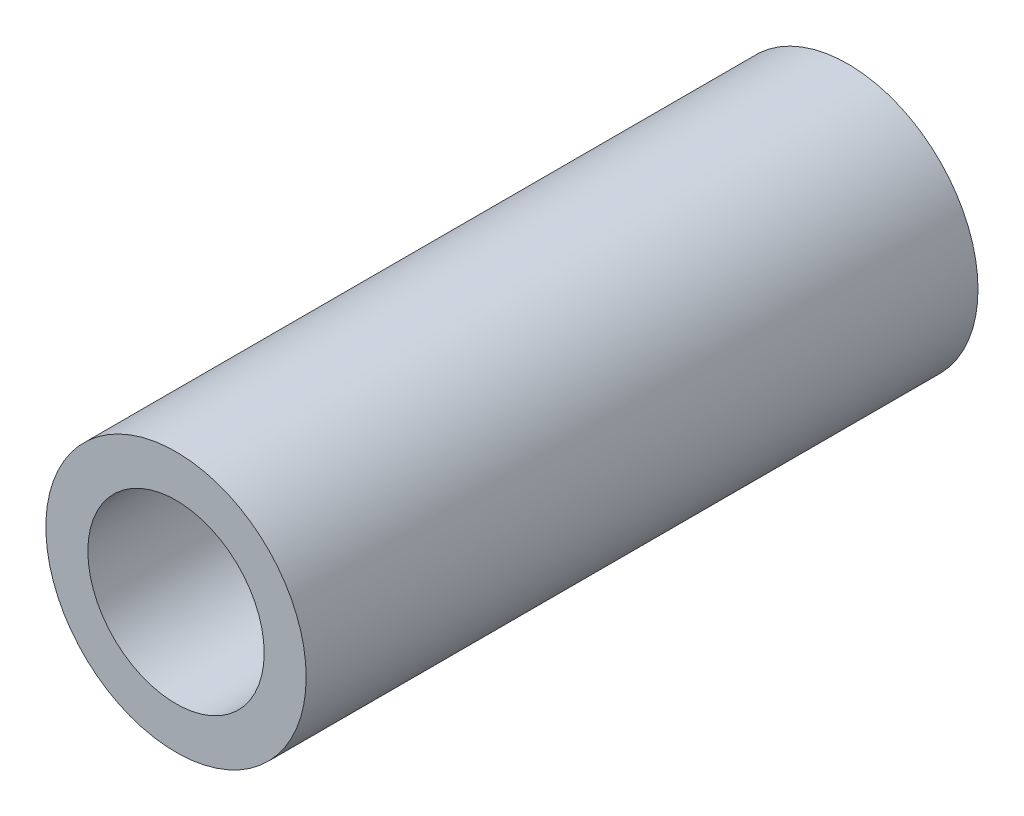
ISO-10303-21;
HEADER;
FILE_DESCRIPTION(('STEP AP214'),'2;1');
FILE_NAME('part.step','',(''),(''),'','','');
FILE_SCHEMA(('AUTOMOTIVE_DESIGN { 1 0 10303 214 1 1 1 1 }'));
ENDSEC;
DATA;
#1=APPLICATION_CONTEXT('core data for automotive mechanical design processes');
#2=APPLICATION_PROTOCOL_DEFINITION('international standard','automotive_design',2000,#1);
#3=PRODUCT_CONTEXT('',#1,'mechanical');
#4=PRODUCT('Part','Part','',(#3));
#5=PRODUCT_RELATED_PRODUCT_CATEGORY('part','',(#4));
#6=PRODUCT_DEFINITION_FORMATION('','',#4);
#7=PRODUCT_DEFINITION_CONTEXT('part definition',#1,'design');
#8=PRODUCT_DEFINITION('design','',#6,#7);
#9=PRODUCT_DEFINITION_SHAPE('','',#8);
#10=(LENGTH_UNIT() NAMED_UNIT(*) SI_UNIT(.MILLI.,.METRE.));
#11=(NAMED_UNIT(*) PLANE_ANGLE_UNIT() SI_UNIT($,.RADIAN.));
#12=(NAMED_UNIT(*) SI_UNIT($,.STERADIAN.) SOLID_ANGLE_UNIT());
#13=UNCERTAINTY_MEASURE_WITH_UNIT(LENGTH_MEASURE(1.E-05),#10,'distance_accuracy_value','');
#14=(GEOMETRIC_REPRESENTATION_CONTEXT(3) GLOBAL_UNCERTAINTY_ASSIGNED_CONTEXT((#13)) GLOBAL_UNIT_ASSIGNED_CONTEXT((#10,
#11,#12)) REPRESENTATION_CONTEXT('',''));
#15=CARTESIAN_POINT('',(0.,0.,0.));
#16=DIRECTION('',(0.,0.,1.));
#17=DIRECTION('',(1.,0.,0.));
#18=AXIS2_PLACEMENT_3D('',#15,#16,#17);
#19=CARTESIAN_POINT('',(0.,0.,16.));
#20=DIRECTION('',(0.,0.,1.));
#21=DIRECTION('',(1.,0.,0.));
#22=AXIS2_PLACEMENT_3D('',#19,#20,#21);
#23=PLANE('',#22);
#24=CARTESIAN_POINT('',(0.,0.,16.));
#25=DIRECTION('',(0.,0.,1.));
#26=DIRECTION('',(1.,0.,0.));
#27=AXIS2_PLACEMENT_3D('',#24,#25,#26);
#28=CIRCLE('',#27,3.1);
#29=CARTESIAN_POINT('',(3.1,0.,16.));
#30=VERTEX_POINT('',#29);
#31=EDGE_CURVE('E10',#30,#30,#28,.T.);
#32=ORIENTED_EDGE('',*,*,#31,.T.);
#33=EDGE_LOOP('',(#32));
#34=FACE_BOUND('',#33,.T.);
#35=CARTESIAN_POINT('',(0.,0.,16.));
#36=DIRECTION('',(0.,0.,1.));
#37=DIRECTION('',(1.,0.,0.));
#38=AXIS2_PLACEMENT_3D('',#35,#36,#37);
#39=CIRCLE('',#38,2.1);
#40=CARTESIAN_POINT('',(2.1,0.,16.));
#41=VERTEX_POINT('',#40);
#42=EDGE_CURVE('E42',#41,#41,#39,.T.);
#43=ORIENTED_EDGE('',*,*,#42,.F.);
#44=EDGE_LOOP('',(#43));
#45=FACE_BOUND('',#44,.T.);
#46=ADVANCED_FACE('F31',(#34,#45),#23,.T.);
#47=CARTESIAN_POINT('',(0.,0.,0.));
#48=DIRECTION('',(0.,0.,1.));
#49=DIRECTION('',(1.,0.,0.));
#50=AXIS2_PLACEMENT_3D('',#47,#48,#49);
#51=PLANE('',#50);
#52=CARTESIAN_POINT('',(0.,0.,0.));
#53=DIRECTION('',(0.,0.,1.));
#54=DIRECTION('',(1.,0.,0.));
#55=AXIS2_PLACEMENT_3D('',#52,#53,#54);
#56=CIRCLE('',#55,3.1);
#57=CARTESIAN_POINT('',(3.1,0.,0.));
#58=VERTEX_POINT('',#57);
#59=EDGE_CURVE('E35',#58,#58,#56,.T.);
#60=ORIENTED_EDGE('',*,*,#59,.F.);
#61=EDGE_LOOP('',(#60));
#62=FACE_BOUND('',#61,.T.);
#63=CARTESIAN_POINT('',(0.,0.,0.));
#64=DIRECTION('',(0.,0.,1.));
#65=DIRECTION('',(1.,0.,0.));
#66=AXIS2_PLACEMENT_3D('',#63,#64,#65);
#67=CIRCLE('',#66,2.1);
#68=CARTESIAN_POINT('',(2.1,0.,0.));
#69=VERTEX_POINT('',#68);
#70=EDGE_CURVE('E44',#69,#69,#67,.T.);
#71=ORIENTED_EDGE('',*,*,#70,.T.);
#72=EDGE_LOOP('',(#71));
#73=FACE_BOUND('',#72,.T.);
#74=ADVANCED_FACE('F54',(#62,#73),#51,.F.);
#75=CARTESIAN_POINT('',(0.,0.,16.));
#76=DIRECTION('',(0.,0.,-1.));
#77=DIRECTION('',(-1.,0.,0.));
#78=AXIS2_PLACEMENT_3D('',#75,#76,#77);
#79=CYLINDRICAL_SURFACE('',#78,3.1);
#80=ORIENTED_EDGE('',*,*,#31,.F.);
#81=EDGE_LOOP('',(#80));
#82=FACE_BOUND('',#81,.T.);
#83=ORIENTED_EDGE('',*,*,#59,.T.);
#84=EDGE_LOOP('',(#83));
#85=FACE_BOUND('',#84,.T.);
#86=ADVANCED_FACE('F33',(#82,#85),#79,.T.);
#87=CARTESIAN_POINT('',(0.,0.,16.));
#88=DIRECTION('',(0.,0.,-1.));
#89=DIRECTION('',(-1.,0.,0.));
#90=AXIS2_PLACEMENT_3D('',#87,#88,#89);
#91=CYLINDRICAL_SURFACE('',#90,2.1);
#92=ORIENTED_EDGE('',*,*,#42,.T.);
#93=EDGE_LOOP('',(#92));
#94=FACE_BOUND('',#93,.T.);
#95=ORIENTED_EDGE('',*,*,#70,.F.);
#96=EDGE_LOOP('',(#95));
#97=FACE_BOUND('',#96,.T.);
#98=ADVANCED_FACE('F50',(#94,#97),#91,.F.);
#99=CLOSED_SHELL('',(#46,#74,#86,#98));
#100=MANIFOLD_SOLID_BREP('B2',#99);
#101=ADVANCED_BREP_SHAPE_REPRESENTATION('',(#18,#100),#14);
#102=SHAPE_DEFINITION_REPRESENTATION(#9,#101);
ENDSEC;
END-ISO-10303-21;
